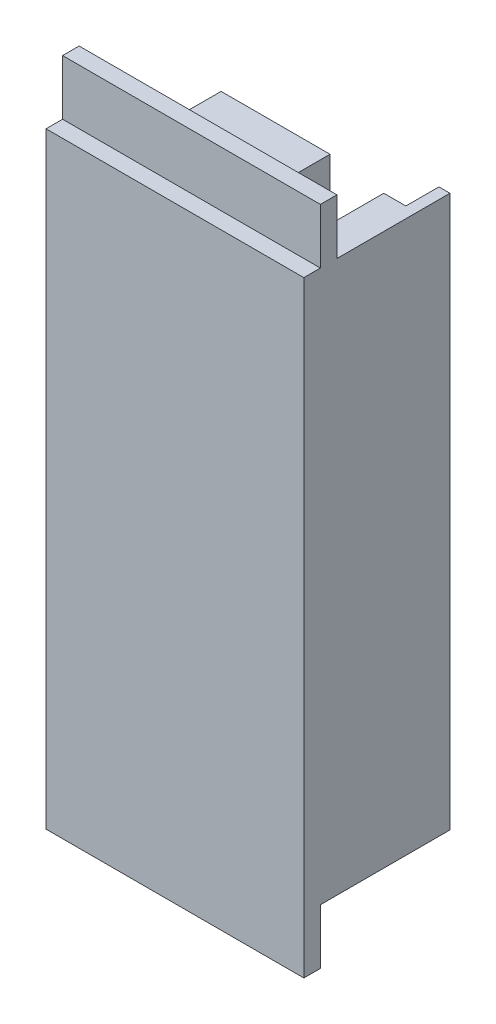
ISO-10303-21;
HEADER;
FILE_DESCRIPTION(('STEP AP214'),'2;1');
FILE_NAME('part.step','',(''),(''),'','','');
FILE_SCHEMA(('AUTOMOTIVE_DESIGN { 1 0 10303 214 1 1 1 1 }'));
ENDSEC;
DATA;
#1=APPLICATION_CONTEXT('core data for automotive mechanical design processes');
#2=APPLICATION_PROTOCOL_DEFINITION('international standard','automotive_design',2000,#1);
#3=PRODUCT_CONTEXT('',#1,'mechanical');
#4=PRODUCT('Part','Part','',(#3));
#5=PRODUCT_RELATED_PRODUCT_CATEGORY('part','',(#4));
#6=PRODUCT_DEFINITION_FORMATION('','',#4);
#7=PRODUCT_DEFINITION_CONTEXT('part definition',#1,'design');
#8=PRODUCT_DEFINITION('design','',#6,#7);
#9=PRODUCT_DEFINITION_SHAPE('','',#8);
#10=(LENGTH_UNIT() NAMED_UNIT(*) SI_UNIT(.MILLI.,.METRE.));
#11=(NAMED_UNIT(*) PLANE_ANGLE_UNIT() SI_UNIT($,.RADIAN.));
#12=(NAMED_UNIT(*) SI_UNIT($,.STERADIAN.) SOLID_ANGLE_UNIT());
#13=UNCERTAINTY_MEASURE_WITH_UNIT(LENGTH_MEASURE(1.E-05),#10,'distance_accuracy_value','');
#14=(GEOMETRIC_REPRESENTATION_CONTEXT(3) GLOBAL_UNCERTAINTY_ASSIGNED_CONTEXT((#13)) GLOBAL_UNIT_ASSIGNED_CONTEXT((#10,
#11,#12)) REPRESENTATION_CONTEXT('',''));
#15=CARTESIAN_POINT('',(0.,0.,0.));
#16=DIRECTION('',(0.,0.,1.));
#17=DIRECTION('',(1.,0.,0.));
#18=AXIS2_PLACEMENT_3D('',#15,#16,#17);
#19=CARTESIAN_POINT('',(0.,100.,0.));
#20=DIRECTION('',(0.,1.,0.));
#21=DIRECTION('',(0.,0.,1.));
#22=AXIS2_PLACEMENT_3D('',#19,#20,#21);
#23=PLANE('',#22);
#24=DIRECTION('',(-1.,0.,0.));
#25=VECTOR('',#24,1.);
#26=CARTESIAN_POINT('',(31.75,100.,0.));
#27=LINE('',#26,#25);
#28=CARTESIAN_POINT('',(31.75,100.,0.));
#29=VERTEX_POINT('',#28);
#30=CARTESIAN_POINT('',(25.75,100.,0.));
#31=VERTEX_POINT('',#30);
#32=EDGE_CURVE('E45',#29,#31,#27,.T.);
#33=ORIENTED_EDGE('',*,*,#32,.F.);
#34=DIRECTION('',(0.,0.,-1.));
#35=VECTOR('',#34,1.);
#36=CARTESIAN_POINT('',(31.75,100.,0.));
#37=LINE('',#36,#35);
#38=CARTESIAN_POINT('',(31.75,100.,-20.5));
#39=VERTEX_POINT('',#38);
#40=EDGE_CURVE('E241',#29,#39,#37,.T.);
#41=ORIENTED_EDGE('',*,*,#40,.T.);
#42=DIRECTION('',(1.,0.,0.));
#43=VECTOR('',#42,1.);
#44=CARTESIAN_POINT('',(0.,100.,-20.5));
#45=LINE('',#44,#43);
#46=CARTESIAN_POINT('',(29.75,100.,-20.5));
#47=VERTEX_POINT('',#46);
#48=EDGE_CURVE('E245',#47,#39,#45,.T.);
#49=ORIENTED_EDGE('',*,*,#48,.F.);
#50=DIRECTION('',(0.,0.,1.));
#51=VECTOR('',#50,1.);
#52=CARTESIAN_POINT('',(29.75,100.,0.));
#53=LINE('',#52,#51);
#54=CARTESIAN_POINT('',(29.75,100.,-14.5));
#55=VERTEX_POINT('',#54);
#56=EDGE_CURVE('E248',#47,#55,#53,.T.);
#57=ORIENTED_EDGE('',*,*,#56,.T.);
#58=DIRECTION('',(-1.,0.,0.));
#59=VECTOR('',#58,1.);
#60=CARTESIAN_POINT('',(0.,100.,-14.5));
#61=LINE('',#60,#59);
#62=CARTESIAN_POINT('',(25.75,100.,-14.5));
#63=VERTEX_POINT('',#62);
#64=EDGE_CURVE('E250',#55,#63,#61,.T.);
#65=ORIENTED_EDGE('',*,*,#64,.T.);
#66=DIRECTION('',(0.,0.,-1.));
#67=VECTOR('',#66,1.);
#68=CARTESIAN_POINT('',(25.75,100.,0.));
#69=LINE('',#68,#67);
#70=EDGE_CURVE('E252',#31,#63,#69,.T.);
#71=ORIENTED_EDGE('',*,*,#70,.F.);
#72=EDGE_LOOP('',(#33,#41,#49,#57,#65,#71));
#73=FACE_BOUND('',#72,.T.);
#74=ADVANCED_FACE('F35',(#73),#23,.T.);
#75=CARTESIAN_POINT('',(9.75,100.,0.));
#76=VERTEX_POINT('',#75);
#77=CARTESIAN_POINT('',(0.,100.,0.));
#78=VERTEX_POINT('',#77);
#79=EDGE_CURVE('E11',#76,#78,#27,.T.);
#80=ORIENTED_EDGE('',*,*,#79,.F.);
#81=DIRECTION('',(0.,0.,-1.));
#82=VECTOR('',#81,1.);
#83=CARTESIAN_POINT('',(9.75,100.,0.));
#84=LINE('',#83,#82);
#85=CARTESIAN_POINT('',(9.75,100.,-6.));
#86=VERTEX_POINT('',#85);
#87=EDGE_CURVE('E255',#76,#86,#84,.T.);
#88=ORIENTED_EDGE('',*,*,#87,.T.);
#89=DIRECTION('',(1.,0.,0.));
#90=VECTOR('',#89,1.);
#91=CARTESIAN_POINT('',(0.,100.,-6.));
#92=LINE('',#91,#90);
#93=CARTESIAN_POINT('',(14.75,100.,-6.));
#94=VERTEX_POINT('',#93);
#95=EDGE_CURVE('E257',#86,#94,#92,.T.);
#96=ORIENTED_EDGE('',*,*,#95,.T.);
#97=DIRECTION('',(0.,0.,-1.));
#98=VECTOR('',#97,1.);
#99=CARTESIAN_POINT('',(14.75,100.,0.));
#100=LINE('',#99,#98);
#101=CARTESIAN_POINT('',(14.75,100.,-15.75));
#102=VERTEX_POINT('',#101);
#103=EDGE_CURVE('E259',#94,#102,#100,.T.);
#104=ORIENTED_EDGE('',*,*,#103,.T.);
#105=DIRECTION('',(1.,0.,0.));
#106=VECTOR('',#105,1.);
#107=CARTESIAN_POINT('',(0.,100.,-15.75));
#108=LINE('',#107,#106);
#109=CARTESIAN_POINT('',(-5.,100.,-15.75));
#110=VERTEX_POINT('',#109);
#111=EDGE_CURVE('E261',#110,#102,#108,.T.);
#112=ORIENTED_EDGE('',*,*,#111,.F.);
#113=DIRECTION('',(0.,0.,-1.));
#114=VECTOR('',#113,1.);
#115=CARTESIAN_POINT('',(-5.,100.,0.));
#116=LINE('',#115,#114);
#117=CARTESIAN_POINT('',(-5.,100.,-6.));
#118=VERTEX_POINT('',#117);
#119=EDGE_CURVE('E264',#118,#110,#116,.T.);
#120=ORIENTED_EDGE('',*,*,#119,.F.);
#121=DIRECTION('',(1.,0.,0.));
#122=VECTOR('',#121,1.);
#123=CARTESIAN_POINT('',(0.,100.,-6.00000000000001));
#124=LINE('',#123,#122);
#125=CARTESIAN_POINT('',(0.,100.,-6.00000000000001));
#126=VERTEX_POINT('',#125);
#127=EDGE_CURVE('E267',#118,#126,#124,.T.);
#128=ORIENTED_EDGE('',*,*,#127,.T.);
#129=DIRECTION('',(0.,0.,-1.));
#130=VECTOR('',#129,1.);
#131=CARTESIAN_POINT('',(0.,100.,0.));
#132=LINE('',#131,#130);
#133=EDGE_CURVE('E269',#78,#126,#132,.T.);
#134=ORIENTED_EDGE('',*,*,#133,.F.);
#135=EDGE_LOOP('',(#80,#88,#96,#104,#112,#120,#128,#134));
#136=FACE_BOUND('',#135,.T.);
#137=ADVANCED_FACE('F387',(#136),#23,.T.);
#138=CARTESIAN_POINT('',(0.,0.,0.));
#139=DIRECTION('',(0.,1.,0.));
#140=DIRECTION('',(0.,0.,1.));
#141=AXIS2_PLACEMENT_3D('',#138,#139,#140);
#142=PLANE('',#141);
#143=DIRECTION('',(1.,0.,0.));
#144=VECTOR('',#143,1.);
#145=CARTESIAN_POINT('',(31.75,0.,3.00000000000001));
#146=LINE('',#145,#144);
#147=CARTESIAN_POINT('',(-15.,0.,3.));
#148=VERTEX_POINT('',#147);
#149=CARTESIAN_POINT('',(31.75,0.,3.00000000000001));
#150=VERTEX_POINT('',#149);
#151=EDGE_CURVE('E218',#148,#150,#146,.T.);
#152=ORIENTED_EDGE('',*,*,#151,.F.);
#153=DIRECTION('',(0.,0.,1.));
#154=VECTOR('',#153,1.);
#155=CARTESIAN_POINT('',(-15.,0.,0.));
#156=LINE('',#155,#154);
#157=CARTESIAN_POINT('',(-15.,0.,0.));
#158=VERTEX_POINT('',#157);
#159=EDGE_CURVE('E242',#158,#148,#156,.T.);
#160=ORIENTED_EDGE('',*,*,#159,.F.);
#161=DIRECTION('',(1.,0.,0.));
#162=VECTOR('',#161,1.);
#163=CARTESIAN_POINT('',(0.,0.,0.));
#164=LINE('',#163,#162);
#165=CARTESIAN_POINT('',(0.,0.,0.));
#166=VERTEX_POINT('',#165);
#167=EDGE_CURVE('E187',#158,#166,#164,.T.);
#168=ORIENTED_EDGE('',*,*,#167,.T.);
#169=DIRECTION('',(0.,0.,-1.));
#170=VECTOR('',#169,1.);
#171=CARTESIAN_POINT('',(0.,0.,0.));
#172=LINE('',#171,#170);
#173=CARTESIAN_POINT('',(0.,0.,-6.00000000000001));
#174=VERTEX_POINT('',#173);
#175=EDGE_CURVE('E305',#166,#174,#172,.T.);
#176=ORIENTED_EDGE('',*,*,#175,.T.);
#177=DIRECTION('',(1.,0.,0.));
#178=VECTOR('',#177,1.);
#179=CARTESIAN_POINT('',(0.,0.,-6.00000000000001));
#180=LINE('',#179,#178);
#181=CARTESIAN_POINT('',(-5.,0.,-6.));
#182=VERTEX_POINT('',#181);
#183=EDGE_CURVE('E302',#182,#174,#180,.T.);
#184=ORIENTED_EDGE('',*,*,#183,.F.);
#185=DIRECTION('',(0.,0.,-1.));
#186=VECTOR('',#185,1.);
#187=CARTESIAN_POINT('',(-5.,0.,0.));
#188=LINE('',#187,#186);
#189=CARTESIAN_POINT('',(-5.,0.,-15.75));
#190=VERTEX_POINT('',#189);
#191=EDGE_CURVE('E299',#182,#190,#188,.T.);
#192=ORIENTED_EDGE('',*,*,#191,.T.);
#193=DIRECTION('',(1.,0.,0.));
#194=VECTOR('',#193,1.);
#195=CARTESIAN_POINT('',(0.,0.,-15.75));
#196=LINE('',#195,#194);
#197=CARTESIAN_POINT('',(14.75,0.,-15.75));
#198=VERTEX_POINT('',#197);
#199=EDGE_CURVE('E296',#190,#198,#196,.T.);
#200=ORIENTED_EDGE('',*,*,#199,.T.);
#201=DIRECTION('',(0.,0.,-1.));
#202=VECTOR('',#201,1.);
#203=CARTESIAN_POINT('',(14.75,0.,0.));
#204=LINE('',#203,#202);
#205=CARTESIAN_POINT('',(14.75,0.,-6.));
#206=VERTEX_POINT('',#205);
#207=EDGE_CURVE('E293',#206,#198,#204,.T.);
#208=ORIENTED_EDGE('',*,*,#207,.F.);
#209=DIRECTION('',(1.,0.,0.));
#210=VECTOR('',#209,1.);
#211=CARTESIAN_POINT('',(0.,0.,-6.));
#212=LINE('',#211,#210);
#213=CARTESIAN_POINT('',(9.75,0.,-6.));
#214=VERTEX_POINT('',#213);
#215=EDGE_CURVE('E291',#214,#206,#212,.T.);
#216=ORIENTED_EDGE('',*,*,#215,.F.);
#217=DIRECTION('',(0.,0.,-1.));
#218=VECTOR('',#217,1.);
#219=CARTESIAN_POINT('',(9.75,0.,0.));
#220=LINE('',#219,#218);
#221=CARTESIAN_POINT('',(9.75,0.,0.));
#222=VERTEX_POINT('',#221);
#223=EDGE_CURVE('E289',#222,#214,#220,.T.);
#224=ORIENTED_EDGE('',*,*,#223,.F.);
#225=DIRECTION('',(1.,0.,0.));
#226=VECTOR('',#225,1.);
#227=CARTESIAN_POINT('',(0.,0.,0.));
#228=LINE('',#227,#226);
#229=CARTESIAN_POINT('',(25.75,0.,0.));
#230=VERTEX_POINT('',#229);
#231=EDGE_CURVE('E286',#222,#230,#228,.T.);
#232=ORIENTED_EDGE('',*,*,#231,.T.);
#233=DIRECTION('',(0.,0.,-1.));
#234=VECTOR('',#233,1.);
#235=CARTESIAN_POINT('',(25.75,0.,0.));
#236=LINE('',#235,#234);
#237=CARTESIAN_POINT('',(25.75,0.,-14.5));
#238=VERTEX_POINT('',#237);
#239=EDGE_CURVE('E283',#230,#238,#236,.T.);
#240=ORIENTED_EDGE('',*,*,#239,.T.);
#241=DIRECTION('',(-1.,0.,0.));
#242=VECTOR('',#241,1.);
#243=CARTESIAN_POINT('',(0.,0.,-14.5));
#244=LINE('',#243,#242);
#245=CARTESIAN_POINT('',(29.75,0.,-14.5));
#246=VERTEX_POINT('',#245);
#247=EDGE_CURVE('E280',#246,#238,#244,.T.);
#248=ORIENTED_EDGE('',*,*,#247,.F.);
#249=DIRECTION('',(0.,0.,1.));
#250=VECTOR('',#249,1.);
#251=CARTESIAN_POINT('',(29.75,0.,0.));
#252=LINE('',#251,#250);
#253=CARTESIAN_POINT('',(29.75,0.,-20.5));
#254=VERTEX_POINT('',#253);
#255=EDGE_CURVE('E278',#254,#246,#252,.T.);
#256=ORIENTED_EDGE('',*,*,#255,.F.);
#257=DIRECTION('',(1.,0.,0.));
#258=VECTOR('',#257,1.);
#259=CARTESIAN_POINT('',(0.,0.,-20.5));
#260=LINE('',#259,#258);
#261=CARTESIAN_POINT('',(31.75,0.,-20.5));
#262=VERTEX_POINT('',#261);
#263=EDGE_CURVE('E275',#254,#262,#260,.T.);
#264=ORIENTED_EDGE('',*,*,#263,.T.);
#265=DIRECTION('',(0.,0.,-1.));
#266=VECTOR('',#265,1.);
#267=CARTESIAN_POINT('',(31.75,0.,0.));
#268=LINE('',#267,#266);
#269=EDGE_CURVE('E237',#150,#262,#268,.T.);
#270=ORIENTED_EDGE('',*,*,#269,.F.);
#271=EDGE_LOOP('',(#152,#160,#168,#176,#184,#192,#200,#208,#216,#224,#232,#240,#248,#256,#264,#270));
#272=FACE_BOUND('',#271,.T.);
#273=ADVANCED_FACE('F358',(#272),#142,.F.);
#274=CARTESIAN_POINT('',(0.,100.,6.));
#275=DIRECTION('',(0.,0.,-1.));
#276=DIRECTION('',(-1.,0.,0.));
#277=AXIS2_PLACEMENT_3D('',#274,#275,#276);
#278=PLANE('',#277);
#279=DIRECTION('',(0.,-1.,0.));
#280=VECTOR('',#279,1.);
#281=CARTESIAN_POINT('',(-15.,100.,6.));
#282=LINE('',#281,#280);
#283=CARTESIAN_POINT('',(-15.,100.,6.));
#284=VERTEX_POINT('',#283);
#285=CARTESIAN_POINT('',(-15.,-10.,6.));
#286=VERTEX_POINT('',#285);
#287=EDGE_CURVE('E192',#284,#286,#282,.T.);
#288=ORIENTED_EDGE('',*,*,#287,.T.);
#289=DIRECTION('',(-1.,0.,0.));
#290=VECTOR('',#289,1.);
#291=CARTESIAN_POINT('',(-15.,-10.,6.));
#292=LINE('',#291,#290);
#293=CARTESIAN_POINT('',(31.75,-10.,6.));
#294=VERTEX_POINT('',#293);
#295=EDGE_CURVE('E222',#294,#286,#292,.T.);
#296=ORIENTED_EDGE('',*,*,#295,.F.);
#297=DIRECTION('',(0.,-1.,0.));
#298=VECTOR('',#297,1.);
#299=CARTESIAN_POINT('',(31.75,100.,6.));
#300=LINE('',#299,#298);
#301=CARTESIAN_POINT('',(31.75,100.,6.));
#302=VERTEX_POINT('',#301);
#303=EDGE_CURVE('E39',#302,#294,#300,.T.);
#304=ORIENTED_EDGE('',*,*,#303,.F.);
#305=DIRECTION('',(1.,0.,0.));
#306=VECTOR('',#305,1.);
#307=CARTESIAN_POINT('',(0.,100.,6.));
#308=LINE('',#307,#306);
#309=EDGE_CURVE('E238',#284,#302,#308,.T.);
#310=ORIENTED_EDGE('',*,*,#309,.F.);
#311=EDGE_LOOP('',(#288,#296,#304,#310));
#312=FACE_BOUND('',#311,.T.);
#313=ADVANCED_FACE('F37',(#312),#278,.F.);
#314=CARTESIAN_POINT('',(31.75,100.,0.));
#315=DIRECTION('',(-1.,0.,0.));
#316=DIRECTION('',(0.,0.,1.));
#317=AXIS2_PLACEMENT_3D('',#314,#315,#316);
#318=PLANE('',#317);
#319=ORIENTED_EDGE('',*,*,#303,.T.);
#320=DIRECTION('',(0.,0.,1.));
#321=VECTOR('',#320,1.);
#322=CARTESIAN_POINT('',(31.75,-10.,6.));
#323=LINE('',#322,#321);
#324=CARTESIAN_POINT('',(31.75,-10.,3.00000000000001));
#325=VERTEX_POINT('',#324);
#326=EDGE_CURVE('E219',#325,#294,#323,.T.);
#327=ORIENTED_EDGE('',*,*,#326,.F.);
#328=DIRECTION('',(0.,1.,0.));
#329=VECTOR('',#328,1.);
#330=CARTESIAN_POINT('',(31.75,-10.,3.00000000000001));
#331=LINE('',#330,#329);
#332=EDGE_CURVE('E229',#325,#150,#331,.T.);
#333=ORIENTED_EDGE('',*,*,#332,.T.);
#334=ORIENTED_EDGE('',*,*,#269,.T.);
#335=DIRECTION('',(0.,-1.,0.));
#336=VECTOR('',#335,1.);
#337=CARTESIAN_POINT('',(31.75,100.,-20.5));
#338=LINE('',#337,#336);
#339=EDGE_CURVE('E336',#39,#262,#338,.T.);
#340=ORIENTED_EDGE('',*,*,#339,.F.);
#341=ORIENTED_EDGE('',*,*,#40,.F.);
#342=DIRECTION('',(0.,-1.,0.));
#343=VECTOR('',#342,1.);
#344=CARTESIAN_POINT('',(31.75,110.,0.));
#345=LINE('',#344,#343);
#346=CARTESIAN_POINT('',(31.75,110.,0.));
#347=VERTEX_POINT('',#346);
#348=EDGE_CURVE('E211',#347,#29,#345,.T.);
#349=ORIENTED_EDGE('',*,*,#348,.F.);
#350=DIRECTION('',(0.,0.,-1.));
#351=VECTOR('',#350,1.);
#352=CARTESIAN_POINT('',(31.75,110.,3.));
#353=LINE('',#352,#351);
#354=CARTESIAN_POINT('',(31.75,110.,3.));
#355=VERTEX_POINT('',#354);
#356=EDGE_CURVE('E205',#355,#347,#353,.T.);
#357=ORIENTED_EDGE('',*,*,#356,.F.);
#358=DIRECTION('',(0.,-1.,0.));
#359=VECTOR('',#358,1.);
#360=CARTESIAN_POINT('',(31.75,110.,3.));
#361=LINE('',#360,#359);
#362=CARTESIAN_POINT('',(31.75,100.,3.));
#363=VERTEX_POINT('',#362);
#364=EDGE_CURVE('E214',#355,#363,#361,.T.);
#365=ORIENTED_EDGE('',*,*,#364,.T.);
#366=EDGE_CURVE('E243',#302,#363,#37,.T.);
#367=ORIENTED_EDGE('',*,*,#366,.F.);
#368=EDGE_LOOP('',(#319,#327,#333,#334,#340,#341,#349,#357,#365,#367));
#369=FACE_BOUND('',#368,.T.);
#370=ADVANCED_FACE('F345',(#369),#318,.F.);
#371=CARTESIAN_POINT('',(0.,100.,-20.5));
#372=DIRECTION('',(0.,0.,-1.));
#373=DIRECTION('',(-1.,0.,0.));
#374=AXIS2_PLACEMENT_3D('',#371,#372,#373);
#375=PLANE('',#374);
#376=ORIENTED_EDGE('',*,*,#263,.F.);
#377=DIRECTION('',(0.,-1.,0.));
#378=VECTOR('',#377,1.);
#379=CARTESIAN_POINT('',(29.75,100.,-20.5));
#380=LINE('',#379,#378);
#381=EDGE_CURVE('E335',#47,#254,#380,.T.);
#382=ORIENTED_EDGE('',*,*,#381,.F.);
#383=ORIENTED_EDGE('',*,*,#48,.T.);
#384=ORIENTED_EDGE('',*,*,#339,.T.);
#385=EDGE_LOOP('',(#376,#382,#383,#384));
#386=FACE_BOUND('',#385,.T.);
#387=ADVANCED_FACE('F361',(#386),#375,.T.);
#388=CARTESIAN_POINT('',(29.75,100.,0.));
#389=DIRECTION('',(1.,0.,0.));
#390=DIRECTION('',(0.,0.,-1.));
#391=AXIS2_PLACEMENT_3D('',#388,#389,#390);
#392=PLANE('',#391);
#393=ORIENTED_EDGE('',*,*,#255,.T.);
#394=DIRECTION('',(0.,-1.,0.));
#395=VECTOR('',#394,1.);
#396=CARTESIAN_POINT('',(29.75,100.,-14.5));
#397=LINE('',#396,#395);
#398=EDGE_CURVE('E332',#55,#246,#397,.T.);
#399=ORIENTED_EDGE('',*,*,#398,.F.);
#400=ORIENTED_EDGE('',*,*,#56,.F.);
#401=ORIENTED_EDGE('',*,*,#381,.T.);
#402=EDGE_LOOP('',(#393,#399,#400,#401));
#403=FACE_BOUND('',#402,.T.);
#404=ADVANCED_FACE('F366',(#403),#392,.F.);
#405=CARTESIAN_POINT('',(0.,100.,-14.5));
#406=DIRECTION('',(0.,0.,1.));
#407=DIRECTION('',(1.,0.,0.));
#408=AXIS2_PLACEMENT_3D('',#405,#406,#407);
#409=PLANE('',#408);
#410=ORIENTED_EDGE('',*,*,#247,.T.);
#411=DIRECTION('',(0.,-1.,0.));
#412=VECTOR('',#411,1.);
#413=CARTESIAN_POINT('',(25.75,100.,-14.5));
#414=LINE('',#413,#412);
#415=EDGE_CURVE('E330',#63,#238,#414,.T.);
#416=ORIENTED_EDGE('',*,*,#415,.F.);
#417=ORIENTED_EDGE('',*,*,#64,.F.);
#418=ORIENTED_EDGE('',*,*,#398,.T.);
#419=EDGE_LOOP('',(#410,#416,#417,#418));
#420=FACE_BOUND('',#419,.T.);
#421=ADVANCED_FACE('F450',(#420),#409,.F.);
#422=CARTESIAN_POINT('',(25.75,100.,0.));
#423=DIRECTION('',(-1.,0.,0.));
#424=DIRECTION('',(0.,0.,1.));
#425=AXIS2_PLACEMENT_3D('',#422,#423,#424);
#426=PLANE('',#425);
#427=ORIENTED_EDGE('',*,*,#239,.F.);
#428=DIRECTION('',(0.,-1.,0.));
#429=VECTOR('',#428,1.);
#430=CARTESIAN_POINT('',(25.75,100.,0.));
#431=LINE('',#430,#429);
#432=EDGE_CURVE('E328',#31,#230,#431,.T.);
#433=ORIENTED_EDGE('',*,*,#432,.F.);
#434=ORIENTED_EDGE('',*,*,#70,.T.);
#435=ORIENTED_EDGE('',*,*,#415,.T.);
#436=EDGE_LOOP('',(#427,#433,#434,#435));
#437=FACE_BOUND('',#436,.T.);
#438=ADVANCED_FACE('F372',(#437),#426,.T.);
#439=CARTESIAN_POINT('',(9.75,100.,0.));
#440=DIRECTION('',(-1.,0.,0.));
#441=DIRECTION('',(0.,0.,1.));
#442=AXIS2_PLACEMENT_3D('',#439,#440,#441);
#443=PLANE('',#442);
#444=ORIENTED_EDGE('',*,*,#223,.T.);
#445=DIRECTION('',(0.,-1.,0.));
#446=VECTOR('',#445,1.);
#447=CARTESIAN_POINT('',(9.75,100.,-6.));
#448=LINE('',#447,#446);
#449=EDGE_CURVE('E323',#86,#214,#448,.T.);
#450=ORIENTED_EDGE('',*,*,#449,.F.);
#451=ORIENTED_EDGE('',*,*,#87,.F.);
#452=DIRECTION('',(0.,-1.,0.));
#453=VECTOR('',#452,1.);
#454=CARTESIAN_POINT('',(9.75,100.,0.));
#455=LINE('',#454,#453);
#456=EDGE_CURVE('E326',#76,#222,#455,.T.);
#457=ORIENTED_EDGE('',*,*,#456,.T.);
#458=EDGE_LOOP('',(#444,#450,#451,#457));
#459=FACE_BOUND('',#458,.T.);
#460=ADVANCED_FACE('F379',(#459),#443,.F.);
#461=CARTESIAN_POINT('',(0.,100.,-6.));
#462=DIRECTION('',(0.,0.,-1.));
#463=DIRECTION('',(-1.,0.,0.));
#464=AXIS2_PLACEMENT_3D('',#461,#462,#463);
#465=PLANE('',#464);
#466=ORIENTED_EDGE('',*,*,#215,.T.);
#467=DIRECTION('',(0.,-1.,0.));
#468=VECTOR('',#467,1.);
#469=CARTESIAN_POINT('',(14.75,100.,-6.));
#470=LINE('',#469,#468);
#471=EDGE_CURVE('E320',#94,#206,#470,.T.);
#472=ORIENTED_EDGE('',*,*,#471,.F.);
#473=ORIENTED_EDGE('',*,*,#95,.F.);
#474=ORIENTED_EDGE('',*,*,#449,.T.);
#475=EDGE_LOOP('',(#466,#472,#473,#474));
#476=FACE_BOUND('',#475,.T.);
#477=ADVANCED_FACE('F383',(#476),#465,.F.);
#478=CARTESIAN_POINT('',(14.75,100.,0.));
#479=DIRECTION('',(-1.,0.,0.));
#480=DIRECTION('',(0.,0.,1.));
#481=AXIS2_PLACEMENT_3D('',#478,#479,#480);
#482=PLANE('',#481);
#483=ORIENTED_EDGE('',*,*,#207,.T.);
#484=DIRECTION('',(0.,-1.,0.));
#485=VECTOR('',#484,1.);
#486=CARTESIAN_POINT('',(14.75,100.,-15.75));
#487=LINE('',#486,#485);
#488=EDGE_CURVE('E318',#102,#198,#487,.T.);
#489=ORIENTED_EDGE('',*,*,#488,.F.);
#490=ORIENTED_EDGE('',*,*,#103,.F.);
#491=ORIENTED_EDGE('',*,*,#471,.T.);
#492=EDGE_LOOP('',(#483,#489,#490,#491));
#493=FACE_BOUND('',#492,.T.);
#494=ADVANCED_FACE('F439',(#493),#482,.F.);
#495=CARTESIAN_POINT('',(0.,100.,-15.75));
#496=DIRECTION('',(0.,0.,-1.));
#497=DIRECTION('',(-1.,0.,0.));
#498=AXIS2_PLACEMENT_3D('',#495,#496,#497);
#499=PLANE('',#498);
#500=ORIENTED_EDGE('',*,*,#199,.F.);
#501=DIRECTION('',(0.,-1.,0.));
#502=VECTOR('',#501,1.);
#503=CARTESIAN_POINT('',(-5.,100.,-15.75));
#504=LINE('',#503,#502);
#505=EDGE_CURVE('E316',#110,#190,#504,.T.);
#506=ORIENTED_EDGE('',*,*,#505,.F.);
#507=ORIENTED_EDGE('',*,*,#111,.T.);
#508=ORIENTED_EDGE('',*,*,#488,.T.);
#509=EDGE_LOOP('',(#500,#506,#507,#508));
#510=FACE_BOUND('',#509,.T.);
#511=ADVANCED_FACE('F435',(#510),#499,.T.);
#512=CARTESIAN_POINT('',(-5.,100.,0.));
#513=DIRECTION('',(-1.,0.,0.));
#514=DIRECTION('',(0.,0.,1.));
#515=AXIS2_PLACEMENT_3D('',#512,#513,#514);
#516=PLANE('',#515);
#517=ORIENTED_EDGE('',*,*,#191,.F.);
#518=DIRECTION('',(0.,-1.,0.));
#519=VECTOR('',#518,1.);
#520=CARTESIAN_POINT('',(-5.,100.,-6.));
#521=LINE('',#520,#519);
#522=EDGE_CURVE('E314',#118,#182,#521,.T.);
#523=ORIENTED_EDGE('',*,*,#522,.F.);
#524=ORIENTED_EDGE('',*,*,#119,.T.);
#525=ORIENTED_EDGE('',*,*,#505,.T.);
#526=EDGE_LOOP('',(#517,#523,#524,#525));
#527=FACE_BOUND('',#526,.T.);
#528=ADVANCED_FACE('F431',(#527),#516,.T.);
#529=CARTESIAN_POINT('',(0.,100.,-6.00000000000001));
#530=DIRECTION('',(0.,0.,-1.));
#531=DIRECTION('',(-1.,0.,0.));
#532=AXIS2_PLACEMENT_3D('',#529,#530,#531);
#533=PLANE('',#532);
#534=ORIENTED_EDGE('',*,*,#183,.T.);
#535=DIRECTION('',(0.,-1.,0.));
#536=VECTOR('',#535,1.);
#537=CARTESIAN_POINT('',(0.,100.,-6.00000000000001));
#538=LINE('',#537,#536);
#539=EDGE_CURVE('E312',#126,#174,#538,.T.);
#540=ORIENTED_EDGE('',*,*,#539,.F.);
#541=ORIENTED_EDGE('',*,*,#127,.F.);
#542=ORIENTED_EDGE('',*,*,#522,.T.);
#543=EDGE_LOOP('',(#534,#540,#541,#542));
#544=FACE_BOUND('',#543,.T.);
#545=ADVANCED_FACE('F428',(#544),#533,.F.);
#546=CARTESIAN_POINT('',(0.,100.,0.));
#547=DIRECTION('',(-1.,0.,0.));
#548=DIRECTION('',(0.,0.,1.));
#549=AXIS2_PLACEMENT_3D('',#546,#547,#548);
#550=PLANE('',#549);
#551=ORIENTED_EDGE('',*,*,#175,.F.);
#552=DIRECTION('',(0.,-1.,0.));
#553=VECTOR('',#552,1.);
#554=CARTESIAN_POINT('',(0.,100.,0.));
#555=LINE('',#554,#553);
#556=EDGE_CURVE('E191',#78,#166,#555,.T.);
#557=ORIENTED_EDGE('',*,*,#556,.F.);
#558=ORIENTED_EDGE('',*,*,#133,.T.);
#559=ORIENTED_EDGE('',*,*,#539,.T.);
#560=EDGE_LOOP('',(#551,#557,#558,#559));
#561=FACE_BOUND('',#560,.T.);
#562=ADVANCED_FACE('F393',(#561),#550,.T.);
#563=CARTESIAN_POINT('',(0.,100.,0.));
#564=DIRECTION('',(0.,0.,-1.));
#565=DIRECTION('',(-1.,0.,0.));
#566=AXIS2_PLACEMENT_3D('',#563,#564,#565);
#567=PLANE('',#566);
#568=ORIENTED_EDGE('',*,*,#167,.F.);
#569=DIRECTION('',(0.,-1.,0.));
#570=VECTOR('',#569,1.);
#571=CARTESIAN_POINT('',(-15.,100.,0.));
#572=LINE('',#571,#570);
#573=CARTESIAN_POINT('',(-15.,110.,0.));
#574=VERTEX_POINT('',#573);
#575=EDGE_CURVE('E180',#574,#158,#572,.T.);
#576=ORIENTED_EDGE('',*,*,#575,.F.);
#577=DIRECTION('',(-1.,0.,0.));
#578=VECTOR('',#577,1.);
#579=CARTESIAN_POINT('',(31.75,110.,0.));
#580=LINE('',#579,#578);
#581=EDGE_CURVE('E185',#347,#574,#580,.T.);
#582=ORIENTED_EDGE('',*,*,#581,.F.);
#583=ORIENTED_EDGE('',*,*,#348,.T.);
#584=ORIENTED_EDGE('',*,*,#32,.T.);
#585=ORIENTED_EDGE('',*,*,#432,.T.);
#586=ORIENTED_EDGE('',*,*,#231,.F.);
#587=ORIENTED_EDGE('',*,*,#456,.F.);
#588=ORIENTED_EDGE('',*,*,#79,.T.);
#589=ORIENTED_EDGE('',*,*,#556,.T.);
#590=EDGE_LOOP('',(#568,#576,#582,#583,#584,#585,#586,#587,#588,#589));
#591=FACE_BOUND('',#590,.T.);
#592=ADVANCED_FACE('F182',(#591),#567,.T.);
#593=CARTESIAN_POINT('',(-15.,100.,0.));
#594=DIRECTION('',(1.,0.,0.));
#595=DIRECTION('',(0.,0.,-1.));
#596=AXIS2_PLACEMENT_3D('',#593,#594,#595);
#597=PLANE('',#596);
#598=ORIENTED_EDGE('',*,*,#159,.T.);
#599=DIRECTION('',(0.,1.,0.));
#600=VECTOR('',#599,1.);
#601=CARTESIAN_POINT('',(-15.,-10.,3.));
#602=LINE('',#601,#600);
#603=CARTESIAN_POINT('',(-15.,-10.,3.));
#604=VERTEX_POINT('',#603);
#605=EDGE_CURVE('E234',#604,#148,#602,.T.);
#606=ORIENTED_EDGE('',*,*,#605,.F.);
#607=DIRECTION('',(0.,0.,-1.));
#608=VECTOR('',#607,1.);
#609=CARTESIAN_POINT('',(-15.,-10.,3.));
#610=LINE('',#609,#608);
#611=EDGE_CURVE('E225',#286,#604,#610,.T.);
#612=ORIENTED_EDGE('',*,*,#611,.F.);
#613=ORIENTED_EDGE('',*,*,#287,.F.);
#614=DIRECTION('',(0.,0.,1.));
#615=VECTOR('',#614,1.);
#616=CARTESIAN_POINT('',(-15.,100.,0.));
#617=LINE('',#616,#615);
#618=CARTESIAN_POINT('',(-15.,100.,3.));
#619=VERTEX_POINT('',#618);
#620=EDGE_CURVE('E272',#619,#284,#617,.T.);
#621=ORIENTED_EDGE('',*,*,#620,.F.);
#622=DIRECTION('',(0.,-1.,0.));
#623=VECTOR('',#622,1.);
#624=CARTESIAN_POINT('',(-15.,110.,3.));
#625=LINE('',#624,#623);
#626=CARTESIAN_POINT('',(-15.,110.,3.));
#627=VERTEX_POINT('',#626);
#628=EDGE_CURVE('E198',#627,#619,#625,.T.);
#629=ORIENTED_EDGE('',*,*,#628,.F.);
#630=DIRECTION('',(0.,0.,1.));
#631=VECTOR('',#630,1.);
#632=CARTESIAN_POINT('',(-15.,110.,0.));
#633=LINE('',#632,#631);
#634=EDGE_CURVE('E195',#574,#627,#633,.T.);
#635=ORIENTED_EDGE('',*,*,#634,.F.);
#636=ORIENTED_EDGE('',*,*,#575,.T.);
#637=EDGE_LOOP('',(#598,#606,#612,#613,#621,#629,#635,#636));
#638=FACE_BOUND('',#637,.T.);
#639=ADVANCED_FACE('F196',(#638),#597,.F.);
#640=DIRECTION('',(1.,0.,0.));
#641=VECTOR('',#640,1.);
#642=CARTESIAN_POINT('',(-15.,100.,3.));
#643=LINE('',#642,#641);
#644=EDGE_CURVE('E52',#619,#363,#643,.T.);
#645=ORIENTED_EDGE('',*,*,#644,.F.);
#646=ORIENTED_EDGE('',*,*,#620,.T.);
#647=ORIENTED_EDGE('',*,*,#309,.T.);
#648=ORIENTED_EDGE('',*,*,#366,.T.);
#649=EDGE_LOOP('',(#645,#646,#647,#648));
#650=FACE_BOUND('',#649,.T.);
#651=ADVANCED_FACE('F396',(#650),#23,.T.);
#652=CARTESIAN_POINT('',(31.75,-10.,3.00000000000001));
#653=DIRECTION('',(0.,0.,1.));
#654=DIRECTION('',(1.,0.,0.));
#655=AXIS2_PLACEMENT_3D('',#652,#653,#654);
#656=PLANE('',#655);
#657=ORIENTED_EDGE('',*,*,#151,.T.);
#658=ORIENTED_EDGE('',*,*,#332,.F.);
#659=DIRECTION('',(1.,0.,0.));
#660=VECTOR('',#659,1.);
#661=CARTESIAN_POINT('',(31.75,-10.,3.00000000000001));
#662=LINE('',#661,#660);
#663=EDGE_CURVE('E227',#604,#325,#662,.T.);
#664=ORIENTED_EDGE('',*,*,#663,.F.);
#665=ORIENTED_EDGE('',*,*,#605,.T.);
#666=EDGE_LOOP('',(#657,#658,#664,#665));
#667=FACE_BOUND('',#666,.T.);
#668=ADVANCED_FACE('F356',(#667),#656,.F.);
#669=CARTESIAN_POINT('',(0.,-10.,0.));
#670=DIRECTION('',(0.,1.,0.));
#671=DIRECTION('',(0.,0.,1.));
#672=AXIS2_PLACEMENT_3D('',#669,#670,#671);
#673=PLANE('',#672);
#674=ORIENTED_EDGE('',*,*,#326,.T.);
#675=ORIENTED_EDGE('',*,*,#295,.T.);
#676=ORIENTED_EDGE('',*,*,#611,.T.);
#677=ORIENTED_EDGE('',*,*,#663,.T.);
#678=EDGE_LOOP('',(#674,#675,#676,#677));
#679=FACE_BOUND('',#678,.T.);
#680=ADVANCED_FACE('F351',(#679),#673,.F.);
#681=CARTESIAN_POINT('',(-15.,110.,3.));
#682=DIRECTION('',(0.,0.,-1.));
#683=DIRECTION('',(-1.,0.,0.));
#684=AXIS2_PLACEMENT_3D('',#681,#682,#683);
#685=PLANE('',#684);
#686=ORIENTED_EDGE('',*,*,#644,.T.);
#687=ORIENTED_EDGE('',*,*,#364,.F.);
#688=DIRECTION('',(1.,0.,0.));
#689=VECTOR('',#688,1.);
#690=CARTESIAN_POINT('',(-15.,110.,3.));
#691=LINE('',#690,#689);
#692=EDGE_CURVE('E201',#627,#355,#691,.T.);
#693=ORIENTED_EDGE('',*,*,#692,.F.);
#694=ORIENTED_EDGE('',*,*,#628,.T.);
#695=EDGE_LOOP('',(#686,#687,#693,#694));
#696=FACE_BOUND('',#695,.T.);
#697=ADVANCED_FACE('F399',(#696),#685,.F.);
#698=CARTESIAN_POINT('',(0.,110.,0.));
#699=DIRECTION('',(0.,1.,0.));
#700=DIRECTION('',(0.,0.,1.));
#701=AXIS2_PLACEMENT_3D('',#698,#699,#700);
#702=PLANE('',#701);
#703=ORIENTED_EDGE('',*,*,#581,.T.);
#704=ORIENTED_EDGE('',*,*,#634,.T.);
#705=ORIENTED_EDGE('',*,*,#692,.T.);
#706=ORIENTED_EDGE('',*,*,#356,.T.);
#707=EDGE_LOOP('',(#703,#704,#705,#706));
#708=FACE_BOUND('',#707,.T.);
#709=ADVANCED_FACE('F203',(#708),#702,.T.);
#710=CLOSED_SHELL('',(#74,#137,#273,#313,#370,#387,#404,#421,#438,#460,#477,#494,#511,#528,#545,
#562,#592,#639,#651,#668,#680,#697,#709));
#711=MANIFOLD_SOLID_BREP('B2',#710);
#712=ADVANCED_BREP_SHAPE_REPRESENTATION('',(#18,#711),#14);
#713=SHAPE_DEFINITION_REPRESENTATION(#9,#712);
ENDSEC;
END-ISO-10303-21;
